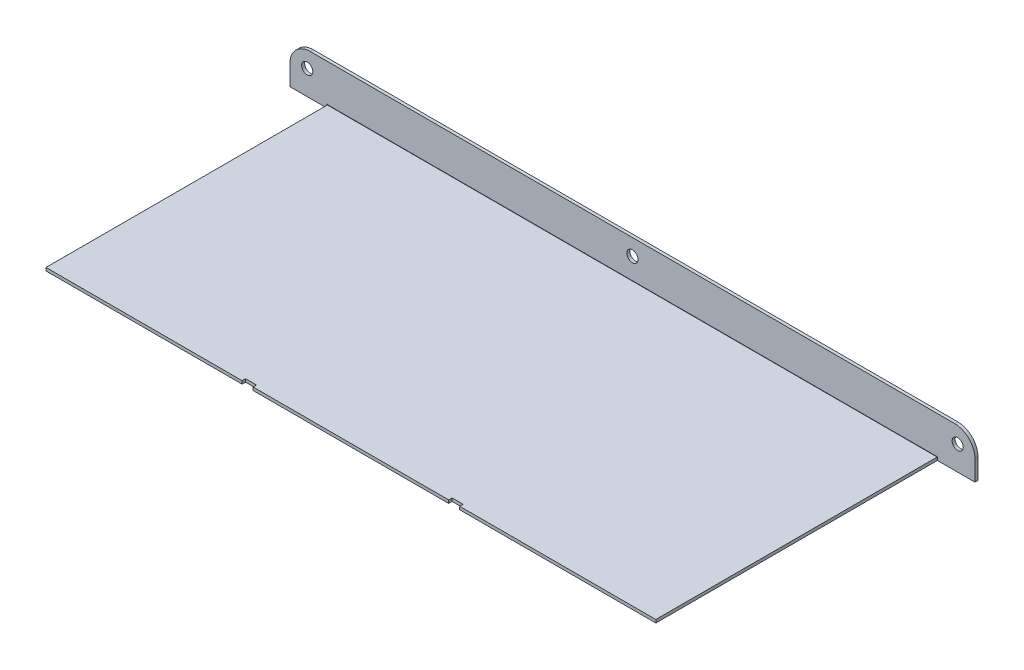
ISO-10303-21;
HEADER;
FILE_DESCRIPTION(('STEP AP214'),'2;1');
FILE_NAME('part.step','',(''),(''),'','','');
FILE_SCHEMA(('AUTOMOTIVE_DESIGN { 1 0 10303 214 1 1 1 1 }'));
ENDSEC;
DATA;
#1=APPLICATION_CONTEXT('core data for automotive mechanical design processes');
#2=APPLICATION_PROTOCOL_DEFINITION('international standard','automotive_design',2000,#1);
#3=PRODUCT_CONTEXT('',#1,'mechanical');
#4=PRODUCT('Part','Part','',(#3));
#5=PRODUCT_RELATED_PRODUCT_CATEGORY('part','',(#4));
#6=PRODUCT_DEFINITION_FORMATION('','',#4);
#7=PRODUCT_DEFINITION_CONTEXT('part definition',#1,'design');
#8=PRODUCT_DEFINITION('design','',#6,#7);
#9=PRODUCT_DEFINITION_SHAPE('','',#8);
#10=(LENGTH_UNIT() NAMED_UNIT(*) SI_UNIT(.MILLI.,.METRE.));
#11=(NAMED_UNIT(*) PLANE_ANGLE_UNIT() SI_UNIT($,.RADIAN.));
#12=(NAMED_UNIT(*) SI_UNIT($,.STERADIAN.) SOLID_ANGLE_UNIT());
#13=UNCERTAINTY_MEASURE_WITH_UNIT(LENGTH_MEASURE(1.E-05),#10,'distance_accuracy_value','');
#14=(GEOMETRIC_REPRESENTATION_CONTEXT(3) GLOBAL_UNCERTAINTY_ASSIGNED_CONTEXT((#13)) GLOBAL_UNIT_ASSIGNED_CONTEXT((#10,
#11,#12)) REPRESENTATION_CONTEXT('',''));
#15=CARTESIAN_POINT('',(0.,0.,0.));
#16=DIRECTION('',(0.,0.,1.));
#17=DIRECTION('',(1.,0.,0.));
#18=AXIS2_PLACEMENT_3D('',#15,#16,#17);
#19=CARTESIAN_POINT('',(300.15,0.,675.185900326717));
#20=DIRECTION('',(-1.,0.,0.));
#21=DIRECTION('',(0.,-1.,0.));
#22=AXIS2_PLACEMENT_3D('',#19,#20,#21);
#23=PLANE('',#22);
#24=DIRECTION('',(0.,-1.,0.));
#25=VECTOR('',#24,1.);
#26=CARTESIAN_POINT('',(300.15,0.,-1.11022302462516E-13));
#27=LINE('',#26,#25);
#28=CARTESIAN_POINT('',(300.15,717.25,-1.11022302462516E-13));
#29=VERTEX_POINT('',#28);
#30=CARTESIAN_POINT('',(300.15,715.5,-1.11022302462516E-13));
#31=VERTEX_POINT('',#30);
#32=EDGE_CURVE('E176',#29,#31,#27,.T.);
#33=ORIENTED_EDGE('',*,*,#32,.T.);
#34=DIRECTION('',(0.,0.,-1.));
#35=VECTOR('',#34,1.);
#36=CARTESIAN_POINT('',(300.15,715.5,675.185900326717));
#37=LINE('',#36,#35);
#38=CARTESIAN_POINT('',(300.15,715.5,1.49999999999983));
#39=VERTEX_POINT('',#38);
#40=EDGE_CURVE('E482',#39,#31,#37,.T.);
#41=ORIENTED_EDGE('',*,*,#40,.F.);
#42=DIRECTION('',(0.,1.,0.));
#43=VECTOR('',#42,1.);
#44=CARTESIAN_POINT('',(300.15,0.,1.49999999999983));
#45=LINE('',#44,#43);
#46=CARTESIAN_POINT('',(300.15,717.25,1.49999999999983));
#47=VERTEX_POINT('',#46);
#48=EDGE_CURVE('E169',#39,#47,#45,.T.);
#49=ORIENTED_EDGE('',*,*,#48,.T.);
#50=DIRECTION('',(0.,0.,-1.));
#51=VECTOR('',#50,1.);
#52=CARTESIAN_POINT('',(300.15,717.25,675.185900326717));
#53=LINE('',#52,#51);
#54=EDGE_CURVE('E629',#47,#29,#53,.T.);
#55=ORIENTED_EDGE('',*,*,#54,.T.);
#56=EDGE_LOOP('',(#33,#41,#49,#55));
#57=FACE_BOUND('',#56,.T.);
#58=ADVANCED_FACE('F55',(#57),#23,.T.);
#59=CARTESIAN_POINT('',(0.,715.5,675.185900326717));
#60=DIRECTION('',(0.,-1.,0.));
#61=DIRECTION('',(0.,0.,-1.));
#62=AXIS2_PLACEMENT_3D('',#59,#60,#61);
#63=PLANE('',#62);
#64=DIRECTION('',(1.,0.,0.));
#65=VECTOR('',#64,1.);
#66=CARTESIAN_POINT('',(0.,715.5,-1.11022302462516E-13));
#67=LINE('',#66,#65);
#68=CARTESIAN_POINT('',(318.5,715.5,-1.11022302462516E-13));
#69=VERTEX_POINT('',#68);
#70=EDGE_CURVE('E483',#31,#69,#67,.T.);
#71=ORIENTED_EDGE('',*,*,#70,.T.);
#72=DIRECTION('',(0.,0.,-1.));
#73=VECTOR('',#72,1.);
#74=CARTESIAN_POINT('',(318.5,715.5,675.185900326717));
#75=LINE('',#74,#73);
#76=CARTESIAN_POINT('',(318.5,715.5,1.49999999999983));
#77=VERTEX_POINT('',#76);
#78=EDGE_CURVE('E682',#77,#69,#75,.T.);
#79=ORIENTED_EDGE('',*,*,#78,.F.);
#80=DIRECTION('',(-1.,0.,0.));
#81=VECTOR('',#80,1.);
#82=CARTESIAN_POINT('',(0.,715.5,1.49999999999995));
#83=LINE('',#82,#81);
#84=EDGE_CURVE('E478',#77,#39,#83,.T.);
#85=ORIENTED_EDGE('',*,*,#84,.T.);
#86=ORIENTED_EDGE('',*,*,#40,.T.);
#87=EDGE_LOOP('',(#71,#79,#85,#86));
#88=FACE_BOUND('',#87,.T.);
#89=ADVANCED_FACE('F817',(#88),#63,.T.);
#90=CARTESIAN_POINT('',(318.5,0.,675.185900326717));
#91=DIRECTION('',(1.,0.,0.));
#92=DIRECTION('',(0.,1.,0.));
#93=AXIS2_PLACEMENT_3D('',#90,#91,#92);
#94=PLANE('',#93);
#95=DIRECTION('',(0.,1.,0.));
#96=VECTOR('',#95,1.);
#97=CARTESIAN_POINT('',(318.5,715.5,-1.11022302462516E-13));
#98=LINE('',#97,#96);
#99=CARTESIAN_POINT('',(318.5,725.5,-1.11022302462516E-13));
#100=VERTEX_POINT('',#99);
#101=EDGE_CURVE('E650',#69,#100,#98,.T.);
#102=ORIENTED_EDGE('',*,*,#101,.T.);
#103=DIRECTION('',(0.,0.,-1.));
#104=VECTOR('',#103,1.);
#105=CARTESIAN_POINT('',(318.5,725.5,675.185900326717));
#106=LINE('',#105,#104);
#107=CARTESIAN_POINT('',(318.5,725.5,1.49999999999983));
#108=VERTEX_POINT('',#107);
#109=EDGE_CURVE('E692',#108,#100,#106,.T.);
#110=ORIENTED_EDGE('',*,*,#109,.F.);
#111=DIRECTION('',(0.,1.,0.));
#112=VECTOR('',#111,1.);
#113=CARTESIAN_POINT('',(318.5,0.,1.49999999999983));
#114=LINE('',#113,#112);
#115=EDGE_CURVE('E679',#108,#77,#114,.F.);
#116=ORIENTED_EDGE('',*,*,#115,.T.);
#117=ORIENTED_EDGE('',*,*,#78,.T.);
#118=EDGE_LOOP('',(#102,#110,#116,#117));
#119=FACE_BOUND('',#118,.T.);
#120=ADVANCED_FACE('F827',(#119),#94,.T.);
#121=CARTESIAN_POINT('',(308.5,725.5,675.185900326717));
#122=DIRECTION('',(0.,0.,-1.));
#123=DIRECTION('',(0.,1.,0.));
#124=AXIS2_PLACEMENT_3D('',#121,#122,#123);
#125=CYLINDRICAL_SURFACE('',#124,10.);
#126=CARTESIAN_POINT('',(308.5,725.5,-1.11022302462516E-13));
#127=DIRECTION('',(0.,0.,-1.));
#128=DIRECTION('',(-1.,0.,0.));
#129=AXIS2_PLACEMENT_3D('',#126,#127,#128);
#130=CIRCLE('',#129,10.);
#131=CARTESIAN_POINT('',(308.5,735.5,-1.11022302462516E-13));
#132=VERTEX_POINT('',#131);
#133=EDGE_CURVE('E685',#100,#132,#130,.F.);
#134=ORIENTED_EDGE('',*,*,#133,.T.);
#135=DIRECTION('',(0.,0.,-1.));
#136=VECTOR('',#135,1.);
#137=CARTESIAN_POINT('',(308.5,735.5,675.185900326717));
#138=LINE('',#137,#136);
#139=CARTESIAN_POINT('',(308.5,735.5,1.49999999999983));
#140=VERTEX_POINT('',#139);
#141=EDGE_CURVE('E701',#140,#132,#138,.T.);
#142=ORIENTED_EDGE('',*,*,#141,.F.);
#143=CARTESIAN_POINT('',(308.5,725.5,1.49999999999995));
#144=DIRECTION('',(0.,0.,-1.));
#145=DIRECTION('',(-1.,0.,0.));
#146=AXIS2_PLACEMENT_3D('',#143,#144,#145);
#147=CIRCLE('',#146,10.);
#148=EDGE_CURVE('E688',#140,#108,#147,.T.);
#149=ORIENTED_EDGE('',*,*,#148,.T.);
#150=ORIENTED_EDGE('',*,*,#109,.T.);
#151=EDGE_LOOP('',(#134,#142,#149,#150));
#152=FACE_BOUND('',#151,.T.);
#153=ADVANCED_FACE('F717',(#152),#125,.T.);
#154=CARTESIAN_POINT('',(0.,735.5,675.185900326717));
#155=DIRECTION('',(0.,1.,0.));
#156=DIRECTION('',(0.,0.,1.));
#157=AXIS2_PLACEMENT_3D('',#154,#155,#156);
#158=PLANE('',#157);
#159=DIRECTION('',(1.,0.,0.));
#160=VECTOR('',#159,1.);
#161=CARTESIAN_POINT('',(298.5,735.5,-1.11022302462516E-13));
#162=LINE('',#161,#160);
#163=CARTESIAN_POINT('',(-8.4999999999999,735.5,-1.11022302462516E-13));
#164=VERTEX_POINT('',#163);
#165=EDGE_CURVE('E707',#132,#164,#162,.F.);
#166=ORIENTED_EDGE('',*,*,#165,.T.);
#167=DIRECTION('',(0.,0.,-1.));
#168=VECTOR('',#167,1.);
#169=CARTESIAN_POINT('',(-8.4999999999999,735.5,675.185900326717));
#170=LINE('',#169,#168);
#171=CARTESIAN_POINT('',(-8.4999999999999,735.5,1.49999999999983));
#172=VERTEX_POINT('',#171);
#173=EDGE_CURVE('E674',#172,#164,#170,.T.);
#174=ORIENTED_EDGE('',*,*,#173,.F.);
#175=DIRECTION('',(-1.,0.,0.));
#176=VECTOR('',#175,1.);
#177=CARTESIAN_POINT('',(0.,735.5,1.49999999999995));
#178=LINE('',#177,#176);
#179=EDGE_CURVE('E705',#172,#140,#178,.F.);
#180=ORIENTED_EDGE('',*,*,#179,.T.);
#181=ORIENTED_EDGE('',*,*,#141,.T.);
#182=EDGE_LOOP('',(#166,#174,#180,#181));
#183=FACE_BOUND('',#182,.T.);
#184=ADVANCED_FACE('F735',(#183),#158,.T.);
#185=CARTESIAN_POINT('',(-8.49999999999991,725.5,675.185900326717));
#186=DIRECTION('',(0.,0.,-1.));
#187=DIRECTION('',(0.,1.,0.));
#188=AXIS2_PLACEMENT_3D('',#185,#186,#187);
#189=CYLINDRICAL_SURFACE('',#188,10.);
#190=CARTESIAN_POINT('',(-8.49999999999991,725.5,-1.11022302462516E-13));
#191=DIRECTION('',(0.,0.,-1.));
#192=DIRECTION('',(-1.,0.,0.));
#193=AXIS2_PLACEMENT_3D('',#190,#191,#192);
#194=CIRCLE('',#193,10.);
#195=CARTESIAN_POINT('',(-18.5,725.5,-1.11022302462516E-13));
#196=VERTEX_POINT('',#195);
#197=EDGE_CURVE('E698',#164,#196,#194,.F.);
#198=ORIENTED_EDGE('',*,*,#197,.T.);
#199=DIRECTION('',(0.,0.,-1.));
#200=VECTOR('',#199,1.);
#201=CARTESIAN_POINT('',(-18.5,725.5,675.185900326717));
#202=LINE('',#201,#200);
#203=CARTESIAN_POINT('',(-18.5,725.5,1.49999999999983));
#204=VERTEX_POINT('',#203);
#205=EDGE_CURVE('E660',#204,#196,#202,.T.);
#206=ORIENTED_EDGE('',*,*,#205,.F.);
#207=CARTESIAN_POINT('',(-8.49999999999991,725.5,1.49999999999995));
#208=DIRECTION('',(0.,0.,-1.));
#209=DIRECTION('',(-1.,0.,0.));
#210=AXIS2_PLACEMENT_3D('',#207,#208,#209);
#211=CIRCLE('',#210,10.);
#212=EDGE_CURVE('E694',#204,#172,#211,.T.);
#213=ORIENTED_EDGE('',*,*,#212,.T.);
#214=ORIENTED_EDGE('',*,*,#173,.T.);
#215=EDGE_LOOP('',(#198,#206,#213,#214));
#216=FACE_BOUND('',#215,.T.);
#217=ADVANCED_FACE('F727',(#216),#189,.T.);
#218=CARTESIAN_POINT('',(-18.5,0.,675.185900326717));
#219=DIRECTION('',(-1.,0.,0.));
#220=DIRECTION('',(0.,-1.,0.));
#221=AXIS2_PLACEMENT_3D('',#218,#219,#220);
#222=PLANE('',#221);
#223=DIRECTION('',(0.,-1.,0.));
#224=VECTOR('',#223,1.);
#225=CARTESIAN_POINT('',(-18.4999999999999,715.5,-1.11022302462516E-13));
#226=LINE('',#225,#224);
#227=CARTESIAN_POINT('',(-18.5,715.5,-1.11022302462516E-13));
#228=VERTEX_POINT('',#227);
#229=EDGE_CURVE('E670',#196,#228,#226,.T.);
#230=ORIENTED_EDGE('',*,*,#229,.T.);
#231=DIRECTION('',(0.,0.,-1.));
#232=VECTOR('',#231,1.);
#233=CARTESIAN_POINT('',(-18.5,715.5,675.185900326717));
#234=LINE('',#233,#232);
#235=CARTESIAN_POINT('',(-18.5,715.5,1.49999999999983));
#236=VERTEX_POINT('',#235);
#237=EDGE_CURVE('E472',#236,#228,#234,.T.);
#238=ORIENTED_EDGE('',*,*,#237,.F.);
#239=DIRECTION('',(0.,1.,0.));
#240=VECTOR('',#239,1.);
#241=CARTESIAN_POINT('',(-18.5,0.,1.49999999999983));
#242=LINE('',#241,#240);
#243=EDGE_CURVE('E666',#236,#204,#242,.T.);
#244=ORIENTED_EDGE('',*,*,#243,.T.);
#245=ORIENTED_EDGE('',*,*,#205,.T.);
#246=EDGE_LOOP('',(#230,#238,#244,#245));
#247=FACE_BOUND('',#246,.T.);
#248=ADVANCED_FACE('F730',(#247),#222,.T.);
#249=CARTESIAN_POINT('',(-0.150000000000008,715.5,-1.11022302462516E-13));
#250=VERTEX_POINT('',#249);
#251=EDGE_CURVE('E484',#228,#250,#67,.T.);
#252=ORIENTED_EDGE('',*,*,#251,.T.);
#253=DIRECTION('',(0.,0.,-1.));
#254=VECTOR('',#253,1.);
#255=CARTESIAN_POINT('',(-0.150000000000006,715.5,675.185900326717));
#256=LINE('',#255,#254);
#257=CARTESIAN_POINT('',(-0.150000000000008,715.5,1.49999999999983));
#258=VERTEX_POINT('',#257);
#259=EDGE_CURVE('E453',#258,#250,#256,.T.);
#260=ORIENTED_EDGE('',*,*,#259,.F.);
#261=EDGE_CURVE('E477',#258,#236,#83,.T.);
#262=ORIENTED_EDGE('',*,*,#261,.T.);
#263=ORIENTED_EDGE('',*,*,#237,.T.);
#264=EDGE_LOOP('',(#252,#260,#262,#263));
#265=FACE_BOUND('',#264,.T.);
#266=ADVANCED_FACE('F814',(#265),#63,.T.);
#267=CARTESIAN_POINT('',(-0.149999999999993,0.,675.185900326717));
#268=DIRECTION('',(1.,0.,0.));
#269=DIRECTION('',(0.,1.,0.));
#270=AXIS2_PLACEMENT_3D('',#267,#268,#269);
#271=PLANE('',#270);
#272=DIRECTION('',(0.,1.,0.));
#273=VECTOR('',#272,1.);
#274=CARTESIAN_POINT('',(-0.149999999999995,0.,-1.11022302462516E-13));
#275=LINE('',#274,#273);
#276=CARTESIAN_POINT('',(-0.150000000000008,717.25,-1.11022302462516E-13));
#277=VERTEX_POINT('',#276);
#278=EDGE_CURVE('E468',#250,#277,#275,.T.);
#279=ORIENTED_EDGE('',*,*,#278,.T.);
#280=DIRECTION('',(0.,0.,-1.));
#281=VECTOR('',#280,1.);
#282=CARTESIAN_POINT('',(-0.150000000000007,717.25,675.185900326717));
#283=LINE('',#282,#281);
#284=CARTESIAN_POINT('',(-0.150000000000008,717.25,1.49999999999983));
#285=VERTEX_POINT('',#284);
#286=EDGE_CURVE('E375',#285,#277,#283,.T.);
#287=ORIENTED_EDGE('',*,*,#286,.F.);
#288=DIRECTION('',(0.,-1.,0.));
#289=VECTOR('',#288,1.);
#290=CARTESIAN_POINT('',(-0.149999999999995,0.,1.49999999999983));
#291=LINE('',#290,#289);
#292=EDGE_CURVE('E458',#285,#258,#291,.T.);
#293=ORIENTED_EDGE('',*,*,#292,.T.);
#294=ORIENTED_EDGE('',*,*,#259,.T.);
#295=EDGE_LOOP('',(#279,#287,#293,#294));
#296=FACE_BOUND('',#295,.T.);
#297=ADVANCED_FACE('F812',(#296),#271,.T.);
#298=CARTESIAN_POINT('',(0.,717.25,675.185900326717));
#299=DIRECTION('',(0.,-1.,0.));
#300=DIRECTION('',(0.,0.,-1.));
#301=AXIS2_PLACEMENT_3D('',#298,#299,#300);
#302=PLANE('',#301);
#303=DIRECTION('',(1.,0.,0.));
#304=VECTOR('',#303,1.);
#305=CARTESIAN_POINT('',(0.,717.25,-1.11022302462516E-13));
#306=LINE('',#305,#304);
#307=CARTESIAN_POINT('',(0.,717.25,-1.11022302462516E-13));
#308=VERTEX_POINT('',#307);
#309=EDGE_CURVE('E450',#277,#308,#306,.T.);
#310=ORIENTED_EDGE('',*,*,#309,.T.);
#311=DIRECTION('',(0.,0.,-1.));
#312=VECTOR('',#311,1.);
#313=CARTESIAN_POINT('',(0.,717.25,675.185900326717));
#314=LINE('',#313,#312);
#315=CARTESIAN_POINT('',(0.,717.25,1.49999999999983));
#316=VERTEX_POINT('',#315);
#317=EDGE_CURVE('E80',#316,#308,#314,.T.);
#318=ORIENTED_EDGE('',*,*,#317,.F.);
#319=DIRECTION('',(-1.,0.,0.));
#320=VECTOR('',#319,1.);
#321=CARTESIAN_POINT('',(0.,717.25,1.49999999999995));
#322=LINE('',#321,#320);
#323=EDGE_CURVE('E444',#316,#285,#322,.T.);
#324=ORIENTED_EDGE('',*,*,#323,.T.);
#325=ORIENTED_EDGE('',*,*,#286,.T.);
#326=EDGE_LOOP('',(#310,#318,#324,#325));
#327=FACE_BOUND('',#326,.T.);
#328=ADVANCED_FACE('F433',(#327),#302,.T.);
#329=CARTESIAN_POINT('',(-10.0000000000002,727.5,1.49999999999995));
#330=DIRECTION('',(0.,0.,1.));
#331=DIRECTION('',(1.,0.,0.));
#332=AXIS2_PLACEMENT_3D('',#329,#330,#331);
#333=CYLINDRICAL_SURFACE('',#332,2.74999999999998);
#334=CARTESIAN_POINT('',(-10.0000000000002,727.5,-1.11022302462516E-13));
#335=DIRECTION('',(0.,0.,1.));
#336=DIRECTION('',(1.,0.,0.));
#337=AXIS2_PLACEMENT_3D('',#334,#335,#336);
#338=CIRCLE('',#337,2.74999999999998);
#339=CARTESIAN_POINT('',(-7.25000000000024,727.5,-1.11028265574464E-13));
#340=VERTEX_POINT('',#339);
#341=EDGE_CURVE('E310',#340,#340,#338,.T.);
#342=ORIENTED_EDGE('',*,*,#341,.F.);
#343=EDGE_LOOP('',(#342));
#344=FACE_BOUND('',#343,.T.);
#345=CARTESIAN_POINT('',(-10.0000000000002,727.5,1.49999999999995));
#346=DIRECTION('',(0.,0.,1.));
#347=DIRECTION('',(1.,0.,0.));
#348=AXIS2_PLACEMENT_3D('',#345,#346,#347);
#349=CIRCLE('',#348,2.74999999999998);
#350=CARTESIAN_POINT('',(-7.25000000000024,727.5,1.49999999999995));
#351=VERTEX_POINT('',#350);
#352=EDGE_CURVE('E370',#351,#351,#349,.T.);
#353=ORIENTED_EDGE('',*,*,#352,.T.);
#354=EDGE_LOOP('',(#353));
#355=FACE_BOUND('',#354,.T.);
#356=ADVANCED_FACE('F429',(#344,#355),#333,.F.);
#357=CARTESIAN_POINT('',(310.,727.5,1.49999999999995));
#358=DIRECTION('',(0.,0.,1.));
#359=DIRECTION('',(1.,0.,0.));
#360=AXIS2_PLACEMENT_3D('',#357,#358,#359);
#361=CYLINDRICAL_SURFACE('',#360,2.74999999999997);
#362=CARTESIAN_POINT('',(310.,727.5,-1.11022302462516E-13));
#363=DIRECTION('',(0.,0.,1.));
#364=DIRECTION('',(1.,0.,0.));
#365=AXIS2_PLACEMENT_3D('',#362,#363,#364);
#366=CIRCLE('',#365,2.74999999999997);
#367=CARTESIAN_POINT('',(312.75,727.5,-1.11028265574464E-13));
#368=VERTEX_POINT('',#367);
#369=EDGE_CURVE('E417',#368,#368,#366,.T.);
#370=ORIENTED_EDGE('',*,*,#369,.F.);
#371=EDGE_LOOP('',(#370));
#372=FACE_BOUND('',#371,.T.);
#373=CARTESIAN_POINT('',(310.,727.5,1.49999999999995));
#374=DIRECTION('',(0.,0.,1.));
#375=DIRECTION('',(1.,0.,0.));
#376=AXIS2_PLACEMENT_3D('',#373,#374,#375);
#377=CIRCLE('',#376,2.74999999999997);
#378=CARTESIAN_POINT('',(312.75,727.5,1.49999999999995));
#379=VERTEX_POINT('',#378);
#380=EDGE_CURVE('E364',#379,#379,#377,.T.);
#381=ORIENTED_EDGE('',*,*,#380,.T.);
#382=EDGE_LOOP('',(#381));
#383=FACE_BOUND('',#382,.T.);
#384=ADVANCED_FACE('F432',(#372,#383),#361,.F.);
#385=CARTESIAN_POINT('',(150.,727.5,1.49999999999995));
#386=DIRECTION('',(0.,0.,1.));
#387=DIRECTION('',(1.,0.,0.));
#388=AXIS2_PLACEMENT_3D('',#385,#386,#387);
#389=CYLINDRICAL_SURFACE('',#388,2.74999999999997);
#390=CARTESIAN_POINT('',(150.,727.5,-1.11022302462516E-13));
#391=DIRECTION('',(0.,0.,1.));
#392=DIRECTION('',(1.,0.,0.));
#393=AXIS2_PLACEMENT_3D('',#390,#391,#392);
#394=CIRCLE('',#393,2.74999999999997);
#395=CARTESIAN_POINT('',(152.75,727.5,-1.11028265574464E-13));
#396=VERTEX_POINT('',#395);
#397=EDGE_CURVE('E333',#396,#396,#394,.T.);
#398=ORIENTED_EDGE('',*,*,#397,.F.);
#399=EDGE_LOOP('',(#398));
#400=FACE_BOUND('',#399,.T.);
#401=CARTESIAN_POINT('',(150.,727.5,1.49999999999995));
#402=DIRECTION('',(0.,0.,1.));
#403=DIRECTION('',(1.,0.,0.));
#404=AXIS2_PLACEMENT_3D('',#401,#402,#403);
#405=CIRCLE('',#404,2.74999999999997);
#406=CARTESIAN_POINT('',(152.75,727.5,1.49999999999995));
#407=VERTEX_POINT('',#406);
#408=EDGE_CURVE('E359',#407,#407,#405,.T.);
#409=ORIENTED_EDGE('',*,*,#408,.T.);
#410=EDGE_LOOP('',(#409));
#411=FACE_BOUND('',#410,.T.);
#412=ADVANCED_FACE('F1021',(#400,#411),#389,.F.);
#413=CARTESIAN_POINT('',(0.,717.25,675.185900326717));
#414=DIRECTION('',(0.,-1.,0.));
#415=DIRECTION('',(0.,0.,-1.));
#416=AXIS2_PLACEMENT_3D('',#413,#414,#415);
#417=PLANE('',#416);
#418=DIRECTION('',(1.,0.,0.));
#419=VECTOR('',#418,1.);
#420=CARTESIAN_POINT('',(0.,717.25,-1.11022302462516E-13));
#421=LINE('',#420,#419);
#422=CARTESIAN_POINT('',(300.,717.25,-1.11022302462516E-13));
#423=VERTEX_POINT('',#422);
#424=EDGE_CURVE('E338',#423,#29,#421,.T.);
#425=ORIENTED_EDGE('',*,*,#424,.T.);
#426=ORIENTED_EDGE('',*,*,#54,.F.);
#427=DIRECTION('',(-1.,0.,0.));
#428=VECTOR('',#427,1.);
#429=CARTESIAN_POINT('',(0.,717.25,1.49999999999995));
#430=LINE('',#429,#428);
#431=CARTESIAN_POINT('',(300.,717.25,1.49999999999983));
#432=VERTEX_POINT('',#431);
#433=EDGE_CURVE('E345',#47,#432,#430,.T.);
#434=ORIENTED_EDGE('',*,*,#433,.T.);
#435=DIRECTION('',(0.,0.,-1.));
#436=VECTOR('',#435,1.);
#437=CARTESIAN_POINT('',(300.,717.25,675.185900326717));
#438=LINE('',#437,#436);
#439=EDGE_CURVE('E340',#432,#423,#438,.T.);
#440=ORIENTED_EDGE('',*,*,#439,.T.);
#441=EDGE_LOOP('',(#425,#426,#434,#440));
#442=FACE_BOUND('',#441,.T.);
#443=ADVANCED_FACE('F645',(#442),#417,.T.);
#444=CARTESIAN_POINT('',(300.,0.,675.185900326717));
#445=DIRECTION('',(1.,0.,0.));
#446=DIRECTION('',(0.,1.,0.));
#447=AXIS2_PLACEMENT_3D('',#444,#445,#446);
#448=PLANE('',#447);
#449=DIRECTION('',(0.,1.,0.));
#450=VECTOR('',#449,1.);
#451=CARTESIAN_POINT('',(300.,0.,-1.11022302462516E-13));
#452=LINE('',#451,#450);
#453=CARTESIAN_POINT('',(300.,717.1,0.));
#454=VERTEX_POINT('',#453);
#455=EDGE_CURVE('E328',#454,#423,#452,.T.);
#456=ORIENTED_EDGE('',*,*,#455,.T.);
#457=ORIENTED_EDGE('',*,*,#439,.F.);
#458=DIRECTION('',(0.,-1.,0.));
#459=VECTOR('',#458,1.);
#460=CARTESIAN_POINT('',(300.,0.,1.49999999999983));
#461=LINE('',#460,#459);
#462=CARTESIAN_POINT('',(300.,717.1,1.49999999999996));
#463=VERTEX_POINT('',#462);
#464=EDGE_CURVE('E331',#432,#463,#461,.T.);
#465=ORIENTED_EDGE('',*,*,#464,.T.);
#466=DIRECTION('',(0.,0.,-1.));
#467=VECTOR('',#466,1.);
#468=CARTESIAN_POINT('',(300.,717.1,675.185900326717));
#469=LINE('',#468,#467);
#470=EDGE_CURVE('E317',#463,#454,#469,.T.);
#471=ORIENTED_EDGE('',*,*,#470,.T.);
#472=EDGE_LOOP('',(#456,#457,#465,#471));
#473=FACE_BOUND('',#472,.T.);
#474=ADVANCED_FACE('F326',(#473),#448,.T.);
#475=CARTESIAN_POINT('',(0.,0.,-1.11022302462516E-13));
#476=DIRECTION('',(0.,0.,1.));
#477=DIRECTION('',(1.,0.,0.));
#478=AXIS2_PLACEMENT_3D('',#475,#476,#477);
#479=PLANE('',#478);
#480=ORIENTED_EDGE('',*,*,#397,.T.);
#481=EDGE_LOOP('',(#480));
#482=FACE_BOUND('',#481,.T.);
#483=ORIENTED_EDGE('',*,*,#369,.T.);
#484=EDGE_LOOP('',(#483));
#485=FACE_BOUND('',#484,.T.);
#486=ORIENTED_EDGE('',*,*,#341,.T.);
#487=EDGE_LOOP('',(#486));
#488=FACE_BOUND('',#487,.T.);
#489=ORIENTED_EDGE('',*,*,#455,.F.);
#490=DIRECTION('',(-1.,0.,0.));
#491=VECTOR('',#490,1.);
#492=CARTESIAN_POINT('',(300.,717.1,-1.11022302462516E-13));
#493=LINE('',#492,#491);
#494=CARTESIAN_POINT('',(0.,717.1,-1.11022302462516E-13));
#495=VERTEX_POINT('',#494);
#496=EDGE_CURVE('E297',#454,#495,#493,.T.);
#497=ORIENTED_EDGE('',*,*,#496,.T.);
#498=DIRECTION('',(0.,-1.,0.));
#499=VECTOR('',#498,1.);
#500=CARTESIAN_POINT('',(0.,0.,-1.11022302462516E-13));
#501=LINE('',#500,#499);
#502=EDGE_CURVE('E309',#308,#495,#501,.T.);
#503=ORIENTED_EDGE('',*,*,#502,.F.);
#504=ORIENTED_EDGE('',*,*,#309,.F.);
#505=ORIENTED_EDGE('',*,*,#278,.F.);
#506=ORIENTED_EDGE('',*,*,#251,.F.);
#507=ORIENTED_EDGE('',*,*,#229,.F.);
#508=ORIENTED_EDGE('',*,*,#197,.F.);
#509=ORIENTED_EDGE('',*,*,#165,.F.);
#510=ORIENTED_EDGE('',*,*,#133,.F.);
#511=ORIENTED_EDGE('',*,*,#101,.F.);
#512=ORIENTED_EDGE('',*,*,#70,.F.);
#513=ORIENTED_EDGE('',*,*,#32,.F.);
#514=ORIENTED_EDGE('',*,*,#424,.F.);
#515=EDGE_LOOP('',(#489,#497,#503,#504,#505,#506,#507,#508,#509,#510,#511,#512,#513,#514));
#516=FACE_BOUND('',#515,.T.);
#517=ADVANCED_FACE('F337',(#482,#485,#488,#516),#479,.F.);
#518=CARTESIAN_POINT('',(0.,0.,675.185900326717));
#519=DIRECTION('',(-1.,0.,0.));
#520=DIRECTION('',(0.,-1.,0.));
#521=AXIS2_PLACEMENT_3D('',#518,#519,#520);
#522=PLANE('',#521);
#523=ORIENTED_EDGE('',*,*,#502,.T.);
#524=DIRECTION('',(0.,0.,-1.));
#525=VECTOR('',#524,1.);
#526=CARTESIAN_POINT('',(0.,717.1,675.185900326717));
#527=LINE('',#526,#525);
#528=CARTESIAN_POINT('',(0.,717.1,1.49999999999996));
#529=VERTEX_POINT('',#528);
#530=EDGE_CURVE('E60',#529,#495,#527,.T.);
#531=ORIENTED_EDGE('',*,*,#530,.F.);
#532=DIRECTION('',(0.,-1.,0.));
#533=VECTOR('',#532,1.);
#534=CARTESIAN_POINT('',(0.,-1.11022302462516E-13,1.49999999999983));
#535=LINE('',#534,#533);
#536=EDGE_CURVE('E67',#316,#529,#535,.T.);
#537=ORIENTED_EDGE('',*,*,#536,.F.);
#538=ORIENTED_EDGE('',*,*,#317,.T.);
#539=EDGE_LOOP('',(#523,#531,#537,#538));
#540=FACE_BOUND('',#539,.T.);
#541=ADVANCED_FACE('F440',(#540),#522,.T.);
#542=CARTESIAN_POINT('',(0.,0.,1.49999999999983));
#543=DIRECTION('',(0.,0.,-1.));
#544=DIRECTION('',(-1.,0.,0.));
#545=AXIS2_PLACEMENT_3D('',#542,#543,#544);
#546=PLANE('',#545);
#547=ORIENTED_EDGE('',*,*,#408,.F.);
#548=EDGE_LOOP('',(#547));
#549=FACE_BOUND('',#548,.T.);
#550=ORIENTED_EDGE('',*,*,#380,.F.);
#551=EDGE_LOOP('',(#550));
#552=FACE_BOUND('',#551,.T.);
#553=ORIENTED_EDGE('',*,*,#352,.F.);
#554=EDGE_LOOP('',(#553));
#555=FACE_BOUND('',#554,.T.);
#556=ORIENTED_EDGE('',*,*,#536,.T.);
#557=DIRECTION('',(1.,0.,0.));
#558=VECTOR('',#557,1.);
#559=CARTESIAN_POINT('',(300.,717.1,1.49999999999983));
#560=LINE('',#559,#558);
#561=EDGE_CURVE('E12',#529,#463,#560,.T.);
#562=ORIENTED_EDGE('',*,*,#561,.T.);
#563=ORIENTED_EDGE('',*,*,#464,.F.);
#564=ORIENTED_EDGE('',*,*,#433,.F.);
#565=ORIENTED_EDGE('',*,*,#48,.F.);
#566=ORIENTED_EDGE('',*,*,#84,.F.);
#567=ORIENTED_EDGE('',*,*,#115,.F.);
#568=ORIENTED_EDGE('',*,*,#148,.F.);
#569=ORIENTED_EDGE('',*,*,#179,.F.);
#570=ORIENTED_EDGE('',*,*,#212,.F.);
#571=ORIENTED_EDGE('',*,*,#243,.F.);
#572=ORIENTED_EDGE('',*,*,#261,.F.);
#573=ORIENTED_EDGE('',*,*,#292,.F.);
#574=ORIENTED_EDGE('',*,*,#323,.F.);
#575=EDGE_LOOP('',(#556,#562,#563,#564,#565,#566,#567,#568,#569,#570,#571,#572,#573,#574));
#576=FACE_BOUND('',#575,.T.);
#577=ADVANCED_FACE('F58',(#549,#552,#555,#576),#546,.F.);
#578=CARTESIAN_POINT('',(300.,1376.2709436711,140.));
#579=DIRECTION('',(1.,0.,0.));
#580=DIRECTION('',(0.,0.,-1.));
#581=AXIS2_PLACEMENT_3D('',#578,#579,#580);
#582=PLANE('',#581);
#583=DIRECTION('',(0.,-1.,0.));
#584=VECTOR('',#583,1.);
#585=CARTESIAN_POINT('',(300.,1376.2709436711,140.));
#586=LINE('',#585,#584);
#587=CARTESIAN_POINT('',(300.,717.,140.));
#588=VERTEX_POINT('',#587);
#589=CARTESIAN_POINT('',(300.,715.5,140.));
#590=VERTEX_POINT('',#589);
#591=EDGE_CURVE('E581',#588,#590,#586,.T.);
#592=ORIENTED_EDGE('',*,*,#591,.T.);
#593=DIRECTION('',(0.,0.,1.));
#594=VECTOR('',#593,1.);
#595=CARTESIAN_POINT('',(300.,715.5,140.));
#596=LINE('',#595,#594);
#597=CARTESIAN_POINT('',(300.,715.5,1.59999999999999));
#598=VERTEX_POINT('',#597);
#599=EDGE_CURVE('E187',#598,#590,#596,.T.);
#600=ORIENTED_EDGE('',*,*,#599,.F.);
#601=DIRECTION('',(0.,-1.,0.));
#602=VECTOR('',#601,1.);
#603=CARTESIAN_POINT('',(300.,1376.2709436711,1.59999999999999));
#604=LINE('',#603,#602);
#605=CARTESIAN_POINT('',(300.,717.,1.59999999999999));
#606=VERTEX_POINT('',#605);
#607=EDGE_CURVE('E320',#606,#598,#604,.T.);
#608=ORIENTED_EDGE('',*,*,#607,.F.);
#609=DIRECTION('',(0.,0.,-1.));
#610=VECTOR('',#609,1.);
#611=CARTESIAN_POINT('',(300.,717.,140.));
#612=LINE('',#611,#610);
#613=EDGE_CURVE('E551',#606,#588,#612,.F.);
#614=ORIENTED_EDGE('',*,*,#613,.T.);
#615=EDGE_LOOP('',(#592,#600,#608,#614));
#616=FACE_BOUND('',#615,.T.);
#617=ADVANCED_FACE('F439',(#616),#582,.T.);
#618=CARTESIAN_POINT('',(0.,1376.2709436711,140.));
#619=DIRECTION('',(-1.,0.,0.));
#620=DIRECTION('',(0.,0.,1.));
#621=AXIS2_PLACEMENT_3D('',#618,#619,#620);
#622=PLANE('',#621);
#623=DIRECTION('',(0.,-1.,0.));
#624=VECTOR('',#623,1.);
#625=CARTESIAN_POINT('',(0.,1376.2709436711,1.59999999999999));
#626=LINE('',#625,#624);
#627=CARTESIAN_POINT('',(0.,717.,1.59999999999999));
#628=VERTEX_POINT('',#627);
#629=CARTESIAN_POINT('',(0.,715.5,1.59999999999999));
#630=VERTEX_POINT('',#629);
#631=EDGE_CURVE('E621',#628,#630,#626,.T.);
#632=ORIENTED_EDGE('',*,*,#631,.T.);
#633=DIRECTION('',(0.,0.,-1.));
#634=VECTOR('',#633,1.);
#635=CARTESIAN_POINT('',(0.,715.5,140.));
#636=LINE('',#635,#634);
#637=CARTESIAN_POINT('',(0.,715.5,140.));
#638=VERTEX_POINT('',#637);
#639=EDGE_CURVE('E405',#638,#630,#636,.T.);
#640=ORIENTED_EDGE('',*,*,#639,.F.);
#641=DIRECTION('',(0.,-1.,0.));
#642=VECTOR('',#641,1.);
#643=CARTESIAN_POINT('',(0.,1376.2709436711,140.));
#644=LINE('',#643,#642);
#645=CARTESIAN_POINT('',(0.,717.,140.));
#646=VERTEX_POINT('',#645);
#647=EDGE_CURVE('E617',#646,#638,#644,.T.);
#648=ORIENTED_EDGE('',*,*,#647,.F.);
#649=DIRECTION('',(0.,0.,-1.));
#650=VECTOR('',#649,1.);
#651=CARTESIAN_POINT('',(0.,717.,140.));
#652=LINE('',#651,#650);
#653=EDGE_CURVE('E199',#646,#628,#652,.T.);
#654=ORIENTED_EDGE('',*,*,#653,.T.);
#655=EDGE_LOOP('',(#632,#640,#648,#654));
#656=FACE_BOUND('',#655,.T.);
#657=ADVANCED_FACE('F800',(#656),#622,.T.);
#658=CARTESIAN_POINT('',(0.,1376.2709436711,140.));
#659=DIRECTION('',(0.,0.,1.));
#660=DIRECTION('',(1.,0.,0.));
#661=AXIS2_PLACEMENT_3D('',#658,#659,#660);
#662=PLANE('',#661);
#663=ORIENTED_EDGE('',*,*,#647,.T.);
#664=DIRECTION('',(1.,0.,0.));
#665=VECTOR('',#664,1.);
#666=CARTESIAN_POINT('',(0.,715.5,140.));
#667=LINE('',#666,#665);
#668=CARTESIAN_POINT('',(96.4666666666666,715.5,140.));
#669=VERTEX_POINT('',#668);
#670=EDGE_CURVE('E509',#638,#669,#667,.T.);
#671=ORIENTED_EDGE('',*,*,#670,.T.);
#672=DIRECTION('',(0.,-1.,0.));
#673=VECTOR('',#672,1.);
#674=CARTESIAN_POINT('',(96.4666666666666,1376.2709436711,140.));
#675=LINE('',#674,#673);
#676=CARTESIAN_POINT('',(96.4666666666666,717.,140.));
#677=VERTEX_POINT('',#676);
#678=EDGE_CURVE('E613',#677,#669,#675,.T.);
#679=ORIENTED_EDGE('',*,*,#678,.F.);
#680=DIRECTION('',(1.,0.,0.));
#681=VECTOR('',#680,1.);
#682=CARTESIAN_POINT('',(0.,717.,140.));
#683=LINE('',#682,#681);
#684=EDGE_CURVE('E550',#677,#646,#683,.F.);
#685=ORIENTED_EDGE('',*,*,#684,.T.);
#686=EDGE_LOOP('',(#663,#671,#679,#685));
#687=FACE_BOUND('',#686,.T.);
#688=ADVANCED_FACE('F799',(#687),#662,.T.);
#689=CARTESIAN_POINT('',(96.4666666666666,1376.2709436711,140.2));
#690=DIRECTION('',(-1.,0.,0.));
#691=DIRECTION('',(0.,0.,1.));
#692=AXIS2_PLACEMENT_3D('',#689,#690,#691);
#693=PLANE('',#692);
#694=DIRECTION('',(0.,0.,-1.));
#695=VECTOR('',#694,1.);
#696=CARTESIAN_POINT('',(96.4666666666666,715.5,140.2));
#697=LINE('',#696,#695);
#698=CARTESIAN_POINT('',(96.4666666666666,715.5,138.3));
#699=VERTEX_POINT('',#698);
#700=EDGE_CURVE('E536',#669,#699,#697,.T.);
#701=ORIENTED_EDGE('',*,*,#700,.T.);
#702=DIRECTION('',(0.,-1.,0.));
#703=VECTOR('',#702,1.);
#704=CARTESIAN_POINT('',(96.4666666666666,1376.2709436711,138.3));
#705=LINE('',#704,#703);
#706=CARTESIAN_POINT('',(96.4666666666666,717.,138.3));
#707=VERTEX_POINT('',#706);
#708=EDGE_CURVE('E609',#707,#699,#705,.T.);
#709=ORIENTED_EDGE('',*,*,#708,.F.);
#710=DIRECTION('',(0.,0.,-1.));
#711=VECTOR('',#710,1.);
#712=CARTESIAN_POINT('',(96.4666666666666,717.,140.2));
#713=LINE('',#712,#711);
#714=EDGE_CURVE('E553',#677,#707,#713,.T.);
#715=ORIENTED_EDGE('',*,*,#714,.F.);
#716=ORIENTED_EDGE('',*,*,#678,.T.);
#717=EDGE_LOOP('',(#701,#709,#715,#716));
#718=FACE_BOUND('',#717,.T.);
#719=ADVANCED_FACE('F795',(#718),#693,.F.);
#720=CARTESIAN_POINT('',(101.866666666667,1376.2709436711,138.3));
#721=DIRECTION('',(0.,0.,1.));
#722=DIRECTION('',(1.,0.,0.));
#723=AXIS2_PLACEMENT_3D('',#720,#721,#722);
#724=PLANE('',#723);
#725=ORIENTED_EDGE('',*,*,#708,.T.);
#726=DIRECTION('',(1.,0.,0.));
#727=VECTOR('',#726,1.);
#728=CARTESIAN_POINT('',(101.866666666667,715.5,138.3));
#729=LINE('',#728,#727);
#730=CARTESIAN_POINT('',(101.866666666667,715.5,138.3));
#731=VERTEX_POINT('',#730);
#732=EDGE_CURVE('E529',#699,#731,#729,.T.);
#733=ORIENTED_EDGE('',*,*,#732,.T.);
#734=DIRECTION('',(0.,-1.,0.));
#735=VECTOR('',#734,1.);
#736=CARTESIAN_POINT('',(101.866666666667,1376.2709436711,138.3));
#737=LINE('',#736,#735);
#738=CARTESIAN_POINT('',(101.866666666667,717.,138.3));
#739=VERTEX_POINT('',#738);
#740=EDGE_CURVE('E605',#739,#731,#737,.T.);
#741=ORIENTED_EDGE('',*,*,#740,.F.);
#742=DIRECTION('',(-1.,0.,0.));
#743=VECTOR('',#742,1.);
#744=CARTESIAN_POINT('',(101.866666666667,717.,138.3));
#745=LINE('',#744,#743);
#746=EDGE_CURVE('E558',#739,#707,#745,.T.);
#747=ORIENTED_EDGE('',*,*,#746,.T.);
#748=EDGE_LOOP('',(#725,#733,#741,#747));
#749=FACE_BOUND('',#748,.T.);
#750=ADVANCED_FACE('F793',(#749),#724,.T.);
#751=CARTESIAN_POINT('',(101.866666666667,1376.2709436711,140.2));
#752=DIRECTION('',(-1.,0.,0.));
#753=DIRECTION('',(0.,0.,1.));
#754=AXIS2_PLACEMENT_3D('',#751,#752,#753);
#755=PLANE('',#754);
#756=ORIENTED_EDGE('',*,*,#740,.T.);
#757=DIRECTION('',(0.,0.,-1.));
#758=VECTOR('',#757,1.);
#759=CARTESIAN_POINT('',(101.866666666667,715.5,140.2));
#760=LINE('',#759,#758);
#761=CARTESIAN_POINT('',(101.866666666667,715.5,140.));
#762=VERTEX_POINT('',#761);
#763=EDGE_CURVE('E526',#762,#731,#760,.T.);
#764=ORIENTED_EDGE('',*,*,#763,.F.);
#765=DIRECTION('',(0.,-1.,0.));
#766=VECTOR('',#765,1.);
#767=CARTESIAN_POINT('',(101.866666666667,1376.2709436711,140.));
#768=LINE('',#767,#766);
#769=CARTESIAN_POINT('',(101.866666666667,717.,140.));
#770=VERTEX_POINT('',#769);
#771=EDGE_CURVE('E601',#770,#762,#768,.T.);
#772=ORIENTED_EDGE('',*,*,#771,.F.);
#773=DIRECTION('',(0.,0.,-1.));
#774=VECTOR('',#773,1.);
#775=CARTESIAN_POINT('',(101.866666666667,717.,140.2));
#776=LINE('',#775,#774);
#777=EDGE_CURVE('E562',#770,#739,#776,.T.);
#778=ORIENTED_EDGE('',*,*,#777,.T.);
#779=EDGE_LOOP('',(#756,#764,#772,#778));
#780=FACE_BOUND('',#779,.T.);
#781=ADVANCED_FACE('F787',(#780),#755,.T.);
#782=ORIENTED_EDGE('',*,*,#771,.T.);
#783=CARTESIAN_POINT('',(198.133333333333,715.5,140.));
#784=VERTEX_POINT('',#783);
#785=EDGE_CURVE('E510',#762,#784,#667,.T.);
#786=ORIENTED_EDGE('',*,*,#785,.T.);
#787=DIRECTION('',(0.,-1.,0.));
#788=VECTOR('',#787,1.);
#789=CARTESIAN_POINT('',(198.133333333333,1376.2709436711,140.));
#790=LINE('',#789,#788);
#791=CARTESIAN_POINT('',(198.133333333333,717.,140.));
#792=VERTEX_POINT('',#791);
#793=EDGE_CURVE('E597',#792,#784,#790,.T.);
#794=ORIENTED_EDGE('',*,*,#793,.F.);
#795=EDGE_CURVE('E573',#792,#770,#683,.F.);
#796=ORIENTED_EDGE('',*,*,#795,.T.);
#797=EDGE_LOOP('',(#782,#786,#794,#796));
#798=FACE_BOUND('',#797,.T.);
#799=ADVANCED_FACE('F783',(#798),#662,.T.);
#800=CARTESIAN_POINT('',(198.133333333333,1376.2709436711,140.2));
#801=DIRECTION('',(-1.,0.,0.));
#802=DIRECTION('',(0.,0.,1.));
#803=AXIS2_PLACEMENT_3D('',#800,#801,#802);
#804=PLANE('',#803);
#805=DIRECTION('',(0.,0.,-1.));
#806=VECTOR('',#805,1.);
#807=CARTESIAN_POINT('',(198.133333333333,715.5,140.2));
#808=LINE('',#807,#806);
#809=CARTESIAN_POINT('',(198.133333333333,715.5,138.3));
#810=VERTEX_POINT('',#809);
#811=EDGE_CURVE('E530',#784,#810,#808,.T.);
#812=ORIENTED_EDGE('',*,*,#811,.T.);
#813=DIRECTION('',(0.,-1.,0.));
#814=VECTOR('',#813,1.);
#815=CARTESIAN_POINT('',(198.133333333333,1376.2709436711,138.3));
#816=LINE('',#815,#814);
#817=CARTESIAN_POINT('',(198.133333333333,717.,138.3));
#818=VERTEX_POINT('',#817);
#819=EDGE_CURVE('E593',#818,#810,#816,.T.);
#820=ORIENTED_EDGE('',*,*,#819,.F.);
#821=DIRECTION('',(0.,0.,-1.));
#822=VECTOR('',#821,1.);
#823=CARTESIAN_POINT('',(198.133333333333,717.,140.2));
#824=LINE('',#823,#822);
#825=EDGE_CURVE('E568',#792,#818,#824,.T.);
#826=ORIENTED_EDGE('',*,*,#825,.F.);
#827=ORIENTED_EDGE('',*,*,#793,.T.);
#828=EDGE_LOOP('',(#812,#820,#826,#827));
#829=FACE_BOUND('',#828,.T.);
#830=ADVANCED_FACE('F779',(#829),#804,.F.);
#831=CARTESIAN_POINT('',(203.533333333333,1376.2709436711,138.3));
#832=DIRECTION('',(0.,0.,1.));
#833=DIRECTION('',(1.,0.,0.));
#834=AXIS2_PLACEMENT_3D('',#831,#832,#833);
#835=PLANE('',#834);
#836=ORIENTED_EDGE('',*,*,#819,.T.);
#837=DIRECTION('',(1.,0.,0.));
#838=VECTOR('',#837,1.);
#839=CARTESIAN_POINT('',(203.533333333333,715.5,138.3));
#840=LINE('',#839,#838);
#841=CARTESIAN_POINT('',(203.533333333333,715.5,138.3));
#842=VERTEX_POINT('',#841);
#843=EDGE_CURVE('E759',#810,#842,#840,.T.);
#844=ORIENTED_EDGE('',*,*,#843,.T.);
#845=DIRECTION('',(0.,-1.,0.));
#846=VECTOR('',#845,1.);
#847=CARTESIAN_POINT('',(203.533333333333,1376.2709436711,138.3));
#848=LINE('',#847,#846);
#849=CARTESIAN_POINT('',(203.533333333333,717.,138.3));
#850=VERTEX_POINT('',#849);
#851=EDGE_CURVE('E589',#850,#842,#848,.T.);
#852=ORIENTED_EDGE('',*,*,#851,.F.);
#853=DIRECTION('',(-1.,0.,0.));
#854=VECTOR('',#853,1.);
#855=CARTESIAN_POINT('',(203.533333333333,717.,138.3));
#856=LINE('',#855,#854);
#857=EDGE_CURVE('E572',#850,#818,#856,.T.);
#858=ORIENTED_EDGE('',*,*,#857,.T.);
#859=EDGE_LOOP('',(#836,#844,#852,#858));
#860=FACE_BOUND('',#859,.T.);
#861=ADVANCED_FACE('F769',(#860),#835,.T.);
#862=CARTESIAN_POINT('',(203.533333333333,1376.2709436711,140.2));
#863=DIRECTION('',(-1.,0.,0.));
#864=DIRECTION('',(0.,0.,1.));
#865=AXIS2_PLACEMENT_3D('',#862,#863,#864);
#866=PLANE('',#865);
#867=ORIENTED_EDGE('',*,*,#851,.T.);
#868=DIRECTION('',(0.,0.,-1.));
#869=VECTOR('',#868,1.);
#870=CARTESIAN_POINT('',(203.533333333333,715.5,140.2));
#871=LINE('',#870,#869);
#872=CARTESIAN_POINT('',(203.533333333333,715.5,140.));
#873=VERTEX_POINT('',#872);
#874=EDGE_CURVE('E508',#873,#842,#871,.T.);
#875=ORIENTED_EDGE('',*,*,#874,.F.);
#876=DIRECTION('',(0.,-1.,0.));
#877=VECTOR('',#876,1.);
#878=CARTESIAN_POINT('',(203.533333333333,1376.2709436711,140.));
#879=LINE('',#878,#877);
#880=CARTESIAN_POINT('',(203.533333333333,717.,140.));
#881=VERTEX_POINT('',#880);
#882=EDGE_CURVE('E585',#881,#873,#879,.T.);
#883=ORIENTED_EDGE('',*,*,#882,.F.);
#884=DIRECTION('',(0.,0.,-1.));
#885=VECTOR('',#884,1.);
#886=CARTESIAN_POINT('',(203.533333333333,717.,140.2));
#887=LINE('',#886,#885);
#888=EDGE_CURVE('E750',#881,#850,#887,.T.);
#889=ORIENTED_EDGE('',*,*,#888,.T.);
#890=EDGE_LOOP('',(#867,#875,#883,#889));
#891=FACE_BOUND('',#890,.T.);
#892=ADVANCED_FACE('F772',(#891),#866,.T.);
#893=ORIENTED_EDGE('',*,*,#882,.T.);
#894=EDGE_CURVE('E504',#873,#590,#667,.T.);
#895=ORIENTED_EDGE('',*,*,#894,.T.);
#896=ORIENTED_EDGE('',*,*,#591,.F.);
#897=EDGE_CURVE('E744',#588,#881,#683,.F.);
#898=ORIENTED_EDGE('',*,*,#897,.T.);
#899=EDGE_LOOP('',(#893,#895,#896,#898));
#900=FACE_BOUND('',#899,.T.);
#901=ADVANCED_FACE('F856',(#900),#662,.T.);
#902=CARTESIAN_POINT('',(0.,717.,140.));
#903=DIRECTION('',(0.,-1.,0.));
#904=DIRECTION('',(0.,0.,-1.));
#905=AXIS2_PLACEMENT_3D('',#902,#903,#904);
#906=PLANE('',#905);
#907=DIRECTION('',(1.,0.,0.));
#908=VECTOR('',#907,1.);
#909=CARTESIAN_POINT('',(300.,717.,1.59999999999999));
#910=LINE('',#909,#908);
#911=EDGE_CURVE('E576',#628,#606,#910,.T.);
#912=ORIENTED_EDGE('',*,*,#911,.F.);
#913=ORIENTED_EDGE('',*,*,#653,.F.);
#914=ORIENTED_EDGE('',*,*,#684,.F.);
#915=ORIENTED_EDGE('',*,*,#714,.T.);
#916=ORIENTED_EDGE('',*,*,#746,.F.);
#917=ORIENTED_EDGE('',*,*,#777,.F.);
#918=ORIENTED_EDGE('',*,*,#795,.F.);
#919=ORIENTED_EDGE('',*,*,#825,.T.);
#920=ORIENTED_EDGE('',*,*,#857,.F.);
#921=ORIENTED_EDGE('',*,*,#888,.F.);
#922=ORIENTED_EDGE('',*,*,#897,.F.);
#923=ORIENTED_EDGE('',*,*,#613,.F.);
#924=EDGE_LOOP('',(#912,#913,#914,#915,#916,#917,#918,#919,#920,#921,#922,#923));
#925=FACE_BOUND('',#924,.T.);
#926=ADVANCED_FACE('F776',(#925),#906,.F.);
#927=CARTESIAN_POINT('',(1.49999999999999,715.5,138.5));
#928=DIRECTION('',(0.,-1.,0.));
#929=DIRECTION('',(0.,0.,-1.));
#930=AXIS2_PLACEMENT_3D('',#927,#928,#929);
#931=PLANE('',#930);
#932=ORIENTED_EDGE('',*,*,#639,.T.);
#933=DIRECTION('',(1.,0.,0.));
#934=VECTOR('',#933,1.);
#935=CARTESIAN_POINT('',(300.,715.5,1.59999999999999));
#936=LINE('',#935,#934);
#937=EDGE_CURVE('E540',#630,#598,#936,.T.);
#938=ORIENTED_EDGE('',*,*,#937,.T.);
#939=ORIENTED_EDGE('',*,*,#599,.T.);
#940=ORIENTED_EDGE('',*,*,#894,.F.);
#941=ORIENTED_EDGE('',*,*,#874,.T.);
#942=ORIENTED_EDGE('',*,*,#843,.F.);
#943=ORIENTED_EDGE('',*,*,#811,.F.);
#944=ORIENTED_EDGE('',*,*,#785,.F.);
#945=ORIENTED_EDGE('',*,*,#763,.T.);
#946=ORIENTED_EDGE('',*,*,#732,.F.);
#947=ORIENTED_EDGE('',*,*,#700,.F.);
#948=ORIENTED_EDGE('',*,*,#670,.F.);
#949=EDGE_LOOP('',(#932,#938,#939,#940,#941,#942,#943,#944,#945,#946,#947,#948));
#950=FACE_BOUND('',#949,.T.);
#951=ADVANCED_FACE('F764',(#950),#931,.T.);
#952=CARTESIAN_POINT('',(300.,717.1,1.59999999999999));
#953=DIRECTION('',(1.,0.,0.));
#954=DIRECTION('',(0.,0.,-1.));
#955=AXIS2_PLACEMENT_3D('',#952,#953,#954);
#956=PLANE('',#955);
#957=ORIENTED_EDGE('',*,*,#470,.F.);
#958=CARTESIAN_POINT('',(300.,717.1,1.59999999999999));
#959=DIRECTION('',(-1.,0.,0.));
#960=DIRECTION('',(0.,0.,1.));
#961=AXIS2_PLACEMENT_3D('',#958,#959,#960);
#962=CIRCLE('',#961,0.10000000000003);
#963=EDGE_CURVE('E406',#463,#606,#962,.T.);
#964=ORIENTED_EDGE('',*,*,#963,.T.);
#965=ORIENTED_EDGE('',*,*,#607,.T.);
#966=CARTESIAN_POINT('',(300.,717.1,1.59999999999999));
#967=DIRECTION('',(-1.,0.,0.));
#968=DIRECTION('',(0.,0.,1.));
#969=AXIS2_PLACEMENT_3D('',#966,#967,#968);
#970=CIRCLE('',#969,1.59999999999998);
#971=EDGE_CURVE('E301',#454,#598,#970,.T.);
#972=ORIENTED_EDGE('',*,*,#971,.F.);
#973=EDGE_LOOP('',(#957,#964,#965,#972));
#974=FACE_BOUND('',#973,.T.);
#975=ADVANCED_FACE('F315',(#974),#956,.T.);
#976=CARTESIAN_POINT('',(0.,717.1,1.59999999999999));
#977=DIRECTION('',(-1.,0.,0.));
#978=DIRECTION('',(0.,0.,1.));
#979=AXIS2_PLACEMENT_3D('',#976,#977,#978);
#980=PLANE('',#979);
#981=CARTESIAN_POINT('',(0.,717.1,1.59999999999999));
#982=DIRECTION('',(-1.,0.,0.));
#983=DIRECTION('',(0.,0.,1.));
#984=AXIS2_PLACEMENT_3D('',#981,#982,#983);
#985=CIRCLE('',#984,0.10000000000003);
#986=EDGE_CURVE('E322',#628,#529,#985,.F.);
#987=ORIENTED_EDGE('',*,*,#986,.T.);
#988=ORIENTED_EDGE('',*,*,#530,.T.);
#989=CARTESIAN_POINT('',(0.,717.1,1.59999999999999));
#990=DIRECTION('',(-1.,0.,0.));
#991=DIRECTION('',(0.,0.,1.));
#992=AXIS2_PLACEMENT_3D('',#989,#990,#991);
#993=CIRCLE('',#992,1.59999999999998);
#994=EDGE_CURVE('E303',#630,#495,#993,.F.);
#995=ORIENTED_EDGE('',*,*,#994,.F.);
#996=ORIENTED_EDGE('',*,*,#631,.F.);
#997=EDGE_LOOP('',(#987,#988,#995,#996));
#998=FACE_BOUND('',#997,.T.);
#999=ADVANCED_FACE('F804',(#998),#980,.T.);
#1000=CARTESIAN_POINT('',(671.906628066777,717.1,1.59999999999999));
#1001=DIRECTION('',(-1.,0.,0.));
#1002=DIRECTION('',(0.,0.,1.));
#1003=AXIS2_PLACEMENT_3D('',#1000,#1001,#1002);
#1004=CYLINDRICAL_SURFACE('',#1003,1.59999999999998);
#1005=ORIENTED_EDGE('',*,*,#937,.F.);
#1006=ORIENTED_EDGE('',*,*,#994,.T.);
#1007=ORIENTED_EDGE('',*,*,#496,.F.);
#1008=ORIENTED_EDGE('',*,*,#971,.T.);
#1009=EDGE_LOOP('',(#1005,#1006,#1007,#1008));
#1010=FACE_BOUND('',#1009,.T.);
#1011=ADVANCED_FACE('F300',(#1010),#1004,.T.);
#1012=CARTESIAN_POINT('',(671.906628066777,717.1,1.59999999999999));
#1013=DIRECTION('',(-1.,0.,0.));
#1014=DIRECTION('',(0.,0.,1.));
#1015=AXIS2_PLACEMENT_3D('',#1012,#1013,#1014);
#1016=CYLINDRICAL_SURFACE('',#1015,0.10000000000003);
#1017=ORIENTED_EDGE('',*,*,#911,.T.);
#1018=ORIENTED_EDGE('',*,*,#963,.F.);
#1019=ORIENTED_EDGE('',*,*,#561,.F.);
#1020=ORIENTED_EDGE('',*,*,#986,.F.);
#1021=EDGE_LOOP('',(#1017,#1018,#1019,#1020));
#1022=FACE_BOUND('',#1021,.T.);
#1023=ADVANCED_FACE('F805',(#1022),#1016,.F.);
#1024=CLOSED_SHELL('',(#58,#89,#120,#153,#184,#217,#248,#266,#297,#328,#356,#384,#412,#443,#474,
#517,#541,#577,#617,#657,#688,#719,#750,#781,#799,#830,#861,#892,#901,#926,#951,#975,#999,#1011,#1023));
#1025=MANIFOLD_SOLID_BREP('B2',#1024);
#1026=ADVANCED_BREP_SHAPE_REPRESENTATION('',(#18,#1025),#14);
#1027=SHAPE_DEFINITION_REPRESENTATION(#9,#1026);
ENDSEC;
END-ISO-10303-21;
